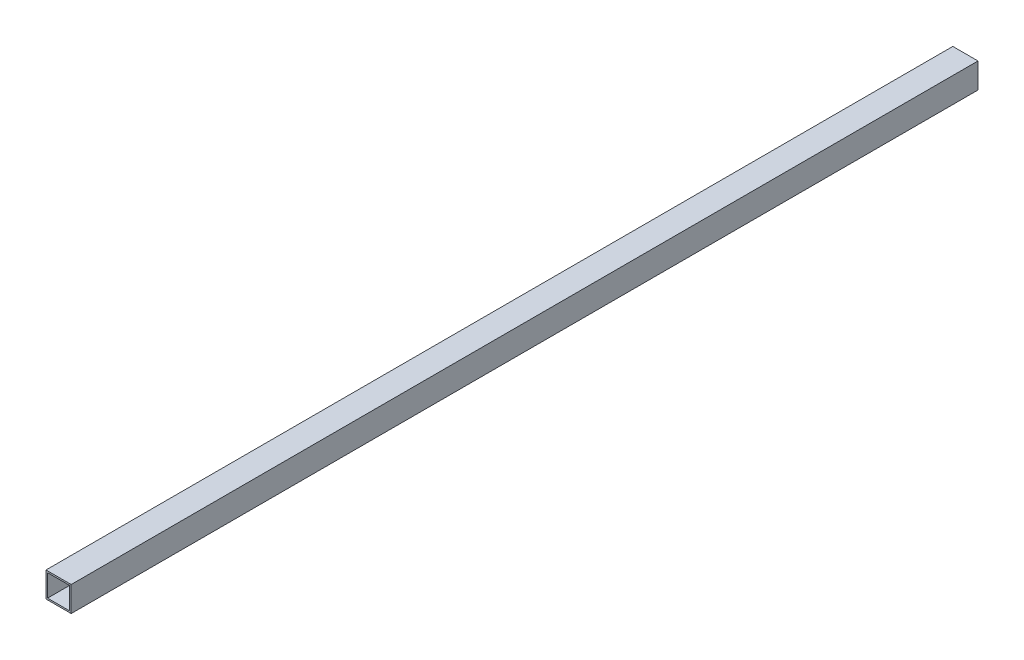
ISO-10303-21;
HEADER;
FILE_DESCRIPTION(('STEP AP214'),'2;1');
FILE_NAME('part.step','',(''),(''),'','','');
FILE_SCHEMA(('AUTOMOTIVE_DESIGN { 1 0 10303 214 1 1 1 1 }'));
ENDSEC;
DATA;
#1=APPLICATION_CONTEXT('core data for automotive mechanical design processes');
#2=APPLICATION_PROTOCOL_DEFINITION('international standard','automotive_design',2000,#1);
#3=PRODUCT_CONTEXT('',#1,'mechanical');
#4=PRODUCT('Part','Part','',(#3));
#5=PRODUCT_RELATED_PRODUCT_CATEGORY('part','',(#4));
#6=PRODUCT_DEFINITION_FORMATION('','',#4);
#7=PRODUCT_DEFINITION_CONTEXT('part definition',#1,'design');
#8=PRODUCT_DEFINITION('design','',#6,#7);
#9=PRODUCT_DEFINITION_SHAPE('','',#8);
#10=(LENGTH_UNIT() NAMED_UNIT(*) SI_UNIT(.MILLI.,.METRE.));
#11=(NAMED_UNIT(*) PLANE_ANGLE_UNIT() SI_UNIT($,.RADIAN.));
#12=(NAMED_UNIT(*) SI_UNIT($,.STERADIAN.) SOLID_ANGLE_UNIT());
#13=UNCERTAINTY_MEASURE_WITH_UNIT(LENGTH_MEASURE(1.E-05),#10,'distance_accuracy_value','');
#14=(GEOMETRIC_REPRESENTATION_CONTEXT(3) GLOBAL_UNCERTAINTY_ASSIGNED_CONTEXT((#13)) GLOBAL_UNIT_ASSIGNED_CONTEXT((#10,
#11,#12)) REPRESENTATION_CONTEXT('',''));
#15=CARTESIAN_POINT('',(0.,0.,0.));
#16=DIRECTION('',(0.,0.,1.));
#17=DIRECTION('',(1.,0.,0.));
#18=AXIS2_PLACEMENT_3D('',#15,#16,#17);
#19=CARTESIAN_POINT('',(0.,0.,914.4));
#20=DIRECTION('',(0.,0.,1.));
#21=DIRECTION('',(1.,0.,0.));
#22=AXIS2_PLACEMENT_3D('',#19,#20,#21);
#23=PLANE('',#22);
#24=DIRECTION('',(0.,1.,0.));
#25=VECTOR('',#24,1.);
#26=CARTESIAN_POINT('',(12.7,12.7,914.4));
#27=LINE('',#26,#25);
#28=CARTESIAN_POINT('',(12.7,-12.7,914.4));
#29=VERTEX_POINT('',#28);
#30=CARTESIAN_POINT('',(12.7,12.7,914.4));
#31=VERTEX_POINT('',#30);
#32=EDGE_CURVE('E133',#29,#31,#27,.T.);
#33=ORIENTED_EDGE('',*,*,#32,.T.);
#34=DIRECTION('',(-1.,0.,0.));
#35=VECTOR('',#34,1.);
#36=CARTESIAN_POINT('',(-12.7,12.7,914.4));
#37=LINE('',#36,#35);
#38=CARTESIAN_POINT('',(-12.7,12.7,914.4));
#39=VERTEX_POINT('',#38);
#40=EDGE_CURVE('E136',#31,#39,#37,.T.);
#41=ORIENTED_EDGE('',*,*,#40,.T.);
#42=DIRECTION('',(0.,-1.,0.));
#43=VECTOR('',#42,1.);
#44=CARTESIAN_POINT('',(-12.7,12.7,914.4));
#45=LINE('',#44,#43);
#46=CARTESIAN_POINT('',(-12.7,-12.7,914.4));
#47=VERTEX_POINT('',#46);
#48=EDGE_CURVE('E139',#39,#47,#45,.T.);
#49=ORIENTED_EDGE('',*,*,#48,.T.);
#50=DIRECTION('',(1.,0.,0.));
#51=VECTOR('',#50,1.);
#52=CARTESIAN_POINT('',(-12.7,-12.7,914.4));
#53=LINE('',#52,#51);
#54=EDGE_CURVE('E141',#47,#29,#53,.T.);
#55=ORIENTED_EDGE('',*,*,#54,.T.);
#56=EDGE_LOOP('',(#33,#41,#49,#55));
#57=FACE_BOUND('',#56,.T.);
#58=DIRECTION('',(-1.,0.,0.));
#59=VECTOR('',#58,1.);
#60=CARTESIAN_POINT('',(-11.1125,11.1125,914.4));
#61=LINE('',#60,#59);
#62=CARTESIAN_POINT('',(11.1125,11.1125,914.4));
#63=VERTEX_POINT('',#62);
#64=CARTESIAN_POINT('',(-11.1125,11.1125,914.4));
#65=VERTEX_POINT('',#64);
#66=EDGE_CURVE('E105',#63,#65,#61,.T.);
#67=ORIENTED_EDGE('',*,*,#66,.F.);
#68=DIRECTION('',(0.,1.,0.));
#69=VECTOR('',#68,1.);
#70=CARTESIAN_POINT('',(11.1125,11.1125,914.4));
#71=LINE('',#70,#69);
#72=CARTESIAN_POINT('',(11.1125,-11.1125,914.4));
#73=VERTEX_POINT('',#72);
#74=EDGE_CURVE('E97',#73,#63,#71,.T.);
#75=ORIENTED_EDGE('',*,*,#74,.F.);
#76=DIRECTION('',(1.,0.,0.));
#77=VECTOR('',#76,1.);
#78=CARTESIAN_POINT('',(-11.1125,-11.1125,914.4));
#79=LINE('',#78,#77);
#80=CARTESIAN_POINT('',(-11.1125,-11.1125,914.4));
#81=VERTEX_POINT('',#80);
#82=EDGE_CURVE('E119',#81,#73,#79,.T.);
#83=ORIENTED_EDGE('',*,*,#82,.F.);
#84=DIRECTION('',(0.,-1.,0.));
#85=VECTOR('',#84,1.);
#86=CARTESIAN_POINT('',(-11.1125,11.1125,914.4));
#87=LINE('',#86,#85);
#88=EDGE_CURVE('E117',#65,#81,#87,.T.);
#89=ORIENTED_EDGE('',*,*,#88,.F.);
#90=EDGE_LOOP('',(#67,#75,#83,#89));
#91=FACE_BOUND('',#90,.T.);
#92=ADVANCED_FACE('F32',(#57,#91),#23,.T.);
#93=CARTESIAN_POINT('',(0.,0.,0.));
#94=DIRECTION('',(0.,0.,1.));
#95=DIRECTION('',(1.,0.,0.));
#96=AXIS2_PLACEMENT_3D('',#93,#94,#95);
#97=PLANE('',#96);
#98=DIRECTION('',(0.,1.,0.));
#99=VECTOR('',#98,1.);
#100=CARTESIAN_POINT('',(12.7,12.7,0.));
#101=LINE('',#100,#99);
#102=CARTESIAN_POINT('',(12.7,-12.7,0.));
#103=VERTEX_POINT('',#102);
#104=CARTESIAN_POINT('',(12.7,12.7,0.));
#105=VERTEX_POINT('',#104);
#106=EDGE_CURVE('E113',#103,#105,#101,.T.);
#107=ORIENTED_EDGE('',*,*,#106,.F.);
#108=DIRECTION('',(1.,0.,0.));
#109=VECTOR('',#108,1.);
#110=CARTESIAN_POINT('',(-12.7,-12.7,0.));
#111=LINE('',#110,#109);
#112=CARTESIAN_POINT('',(-12.7,-12.7,0.));
#113=VERTEX_POINT('',#112);
#114=EDGE_CURVE('E137',#113,#103,#111,.T.);
#115=ORIENTED_EDGE('',*,*,#114,.F.);
#116=DIRECTION('',(0.,-1.,0.));
#117=VECTOR('',#116,1.);
#118=CARTESIAN_POINT('',(-12.7,12.7,0.));
#119=LINE('',#118,#117);
#120=CARTESIAN_POINT('',(-12.7,12.7,0.));
#121=VERTEX_POINT('',#120);
#122=EDGE_CURVE('E148',#121,#113,#119,.T.);
#123=ORIENTED_EDGE('',*,*,#122,.F.);
#124=DIRECTION('',(-1.,0.,0.));
#125=VECTOR('',#124,1.);
#126=CARTESIAN_POINT('',(-12.7,12.7,0.));
#127=LINE('',#126,#125);
#128=EDGE_CURVE('E146',#105,#121,#127,.T.);
#129=ORIENTED_EDGE('',*,*,#128,.F.);
#130=EDGE_LOOP('',(#107,#115,#123,#129));
#131=FACE_BOUND('',#130,.T.);
#132=DIRECTION('',(0.,1.,0.));
#133=VECTOR('',#132,1.);
#134=CARTESIAN_POINT('',(11.1125,11.1125,0.));
#135=LINE('',#134,#133);
#136=CARTESIAN_POINT('',(11.1125,-11.1125,0.));
#137=VERTEX_POINT('',#136);
#138=CARTESIAN_POINT('',(11.1125,11.1125,0.));
#139=VERTEX_POINT('',#138);
#140=EDGE_CURVE('E55',#137,#139,#135,.T.);
#141=ORIENTED_EDGE('',*,*,#140,.T.);
#142=DIRECTION('',(-1.,0.,0.));
#143=VECTOR('',#142,1.);
#144=CARTESIAN_POINT('',(-11.1125,11.1125,0.));
#145=LINE('',#144,#143);
#146=CARTESIAN_POINT('',(-11.1125,11.1125,0.));
#147=VERTEX_POINT('',#146);
#148=EDGE_CURVE('E112',#139,#147,#145,.T.);
#149=ORIENTED_EDGE('',*,*,#148,.T.);
#150=DIRECTION('',(0.,-1.,0.));
#151=VECTOR('',#150,1.);
#152=CARTESIAN_POINT('',(-11.1125,11.1125,0.));
#153=LINE('',#152,#151);
#154=CARTESIAN_POINT('',(-11.1125,-11.1125,0.));
#155=VERTEX_POINT('',#154);
#156=EDGE_CURVE('E125',#147,#155,#153,.T.);
#157=ORIENTED_EDGE('',*,*,#156,.T.);
#158=DIRECTION('',(1.,0.,0.));
#159=VECTOR('',#158,1.);
#160=CARTESIAN_POINT('',(-11.1125,-11.1125,0.));
#161=LINE('',#160,#159);
#162=EDGE_CURVE('E106',#155,#137,#161,.T.);
#163=ORIENTED_EDGE('',*,*,#162,.T.);
#164=EDGE_LOOP('',(#141,#149,#157,#163));
#165=FACE_BOUND('',#164,.T.);
#166=ADVANCED_FACE('F166',(#131,#165),#97,.F.);
#167=CARTESIAN_POINT('',(12.7,12.7,914.4));
#168=DIRECTION('',(-1.,0.,0.));
#169=DIRECTION('',(0.,-1.,0.));
#170=AXIS2_PLACEMENT_3D('',#167,#168,#169);
#171=PLANE('',#170);
#172=ORIENTED_EDGE('',*,*,#106,.T.);
#173=DIRECTION('',(0.,0.,-1.));
#174=VECTOR('',#173,1.);
#175=CARTESIAN_POINT('',(12.7,12.7,914.4));
#176=LINE('',#175,#174);
#177=EDGE_CURVE('E11',#31,#105,#176,.T.);
#178=ORIENTED_EDGE('',*,*,#177,.F.);
#179=ORIENTED_EDGE('',*,*,#32,.F.);
#180=DIRECTION('',(0.,0.,-1.));
#181=VECTOR('',#180,1.);
#182=CARTESIAN_POINT('',(12.7,-12.7,914.4));
#183=LINE('',#182,#181);
#184=EDGE_CURVE('E143',#29,#103,#183,.T.);
#185=ORIENTED_EDGE('',*,*,#184,.T.);
#186=EDGE_LOOP('',(#172,#178,#179,#185));
#187=FACE_BOUND('',#186,.T.);
#188=ADVANCED_FACE('F34',(#187),#171,.F.);
#189=CARTESIAN_POINT('',(-12.7,12.7,914.4));
#190=DIRECTION('',(0.,-1.,0.));
#191=DIRECTION('',(0.,0.,-1.));
#192=AXIS2_PLACEMENT_3D('',#189,#190,#191);
#193=PLANE('',#192);
#194=ORIENTED_EDGE('',*,*,#128,.T.);
#195=DIRECTION('',(0.,0.,-1.));
#196=VECTOR('',#195,1.);
#197=CARTESIAN_POINT('',(-12.7,12.7,914.4));
#198=LINE('',#197,#196);
#199=EDGE_CURVE('E40',#39,#121,#198,.T.);
#200=ORIENTED_EDGE('',*,*,#199,.F.);
#201=ORIENTED_EDGE('',*,*,#40,.F.);
#202=ORIENTED_EDGE('',*,*,#177,.T.);
#203=EDGE_LOOP('',(#194,#200,#201,#202));
#204=FACE_BOUND('',#203,.T.);
#205=ADVANCED_FACE('F176',(#204),#193,.F.);
#206=CARTESIAN_POINT('',(-12.7,12.7,914.4));
#207=DIRECTION('',(1.,0.,0.));
#208=DIRECTION('',(0.,1.,0.));
#209=AXIS2_PLACEMENT_3D('',#206,#207,#208);
#210=PLANE('',#209);
#211=ORIENTED_EDGE('',*,*,#122,.T.);
#212=DIRECTION('',(0.,0.,-1.));
#213=VECTOR('',#212,1.);
#214=CARTESIAN_POINT('',(-12.7,-12.7,914.4));
#215=LINE('',#214,#213);
#216=EDGE_CURVE('E153',#47,#113,#215,.T.);
#217=ORIENTED_EDGE('',*,*,#216,.F.);
#218=ORIENTED_EDGE('',*,*,#48,.F.);
#219=ORIENTED_EDGE('',*,*,#199,.T.);
#220=EDGE_LOOP('',(#211,#217,#218,#219));
#221=FACE_BOUND('',#220,.T.);
#222=ADVANCED_FACE('F160',(#221),#210,.F.);
#223=CARTESIAN_POINT('',(-12.7,-12.7,914.4));
#224=DIRECTION('',(0.,1.,0.));
#225=DIRECTION('',(0.,0.,1.));
#226=AXIS2_PLACEMENT_3D('',#223,#224,#225);
#227=PLANE('',#226);
#228=ORIENTED_EDGE('',*,*,#114,.T.);
#229=ORIENTED_EDGE('',*,*,#184,.F.);
#230=ORIENTED_EDGE('',*,*,#54,.F.);
#231=ORIENTED_EDGE('',*,*,#216,.T.);
#232=EDGE_LOOP('',(#228,#229,#230,#231));
#233=FACE_BOUND('',#232,.T.);
#234=ADVANCED_FACE('F170',(#233),#227,.F.);
#235=CARTESIAN_POINT('',(11.1125,11.1125,914.4));
#236=DIRECTION('',(-1.,0.,0.));
#237=DIRECTION('',(0.,0.,1.));
#238=AXIS2_PLACEMENT_3D('',#235,#236,#237);
#239=PLANE('',#238);
#240=ORIENTED_EDGE('',*,*,#140,.F.);
#241=DIRECTION('',(0.,0.,-1.));
#242=VECTOR('',#241,1.);
#243=CARTESIAN_POINT('',(11.1125,-11.1125,914.4));
#244=LINE('',#243,#242);
#245=EDGE_CURVE('E101',#73,#137,#244,.T.);
#246=ORIENTED_EDGE('',*,*,#245,.F.);
#247=ORIENTED_EDGE('',*,*,#74,.T.);
#248=DIRECTION('',(0.,0.,-1.));
#249=VECTOR('',#248,1.);
#250=CARTESIAN_POINT('',(11.1125,11.1125,914.4));
#251=LINE('',#250,#249);
#252=EDGE_CURVE('E100',#63,#139,#251,.T.);
#253=ORIENTED_EDGE('',*,*,#252,.T.);
#254=EDGE_LOOP('',(#240,#246,#247,#253));
#255=FACE_BOUND('',#254,.T.);
#256=ADVANCED_FACE('F99',(#255),#239,.T.);
#257=CARTESIAN_POINT('',(-11.1125,11.1125,914.4));
#258=DIRECTION('',(0.,-1.,0.));
#259=DIRECTION('',(0.,0.,-1.));
#260=AXIS2_PLACEMENT_3D('',#257,#258,#259);
#261=PLANE('',#260);
#262=ORIENTED_EDGE('',*,*,#148,.F.);
#263=ORIENTED_EDGE('',*,*,#252,.F.);
#264=ORIENTED_EDGE('',*,*,#66,.T.);
#265=DIRECTION('',(0.,0.,-1.));
#266=VECTOR('',#265,1.);
#267=CARTESIAN_POINT('',(-11.1125,11.1125,914.4));
#268=LINE('',#267,#266);
#269=EDGE_CURVE('E114',#65,#147,#268,.T.);
#270=ORIENTED_EDGE('',*,*,#269,.T.);
#271=EDGE_LOOP('',(#262,#263,#264,#270));
#272=FACE_BOUND('',#271,.T.);
#273=ADVANCED_FACE('F109',(#272),#261,.T.);
#274=CARTESIAN_POINT('',(-11.1125,11.1125,914.4));
#275=DIRECTION('',(1.,0.,0.));
#276=DIRECTION('',(0.,0.,-1.));
#277=AXIS2_PLACEMENT_3D('',#274,#275,#276);
#278=PLANE('',#277);
#279=ORIENTED_EDGE('',*,*,#156,.F.);
#280=ORIENTED_EDGE('',*,*,#269,.F.);
#281=ORIENTED_EDGE('',*,*,#88,.T.);
#282=DIRECTION('',(0.,0.,-1.));
#283=VECTOR('',#282,1.);
#284=CARTESIAN_POINT('',(-11.1125,-11.1125,914.4));
#285=LINE('',#284,#283);
#286=EDGE_CURVE('E47',#81,#155,#285,.T.);
#287=ORIENTED_EDGE('',*,*,#286,.T.);
#288=EDGE_LOOP('',(#279,#280,#281,#287));
#289=FACE_BOUND('',#288,.T.);
#290=ADVANCED_FACE('F199',(#289),#278,.T.);
#291=CARTESIAN_POINT('',(-11.1125,-11.1125,914.4));
#292=DIRECTION('',(0.,1.,0.));
#293=DIRECTION('',(0.,0.,1.));
#294=AXIS2_PLACEMENT_3D('',#291,#292,#293);
#295=PLANE('',#294);
#296=ORIENTED_EDGE('',*,*,#162,.F.);
#297=ORIENTED_EDGE('',*,*,#286,.F.);
#298=ORIENTED_EDGE('',*,*,#82,.T.);
#299=ORIENTED_EDGE('',*,*,#245,.T.);
#300=EDGE_LOOP('',(#296,#297,#298,#299));
#301=FACE_BOUND('',#300,.T.);
#302=ADVANCED_FACE('F203',(#301),#295,.T.);
#303=CLOSED_SHELL('',(#92,#166,#188,#205,#222,#234,#256,#273,#290,#302));
#304=MANIFOLD_SOLID_BREP('B2',#303);
#305=ADVANCED_BREP_SHAPE_REPRESENTATION('',(#18,#304),#14);
#306=SHAPE_DEFINITION_REPRESENTATION(#9,#305);
ENDSEC;
END-ISO-10303-21;
